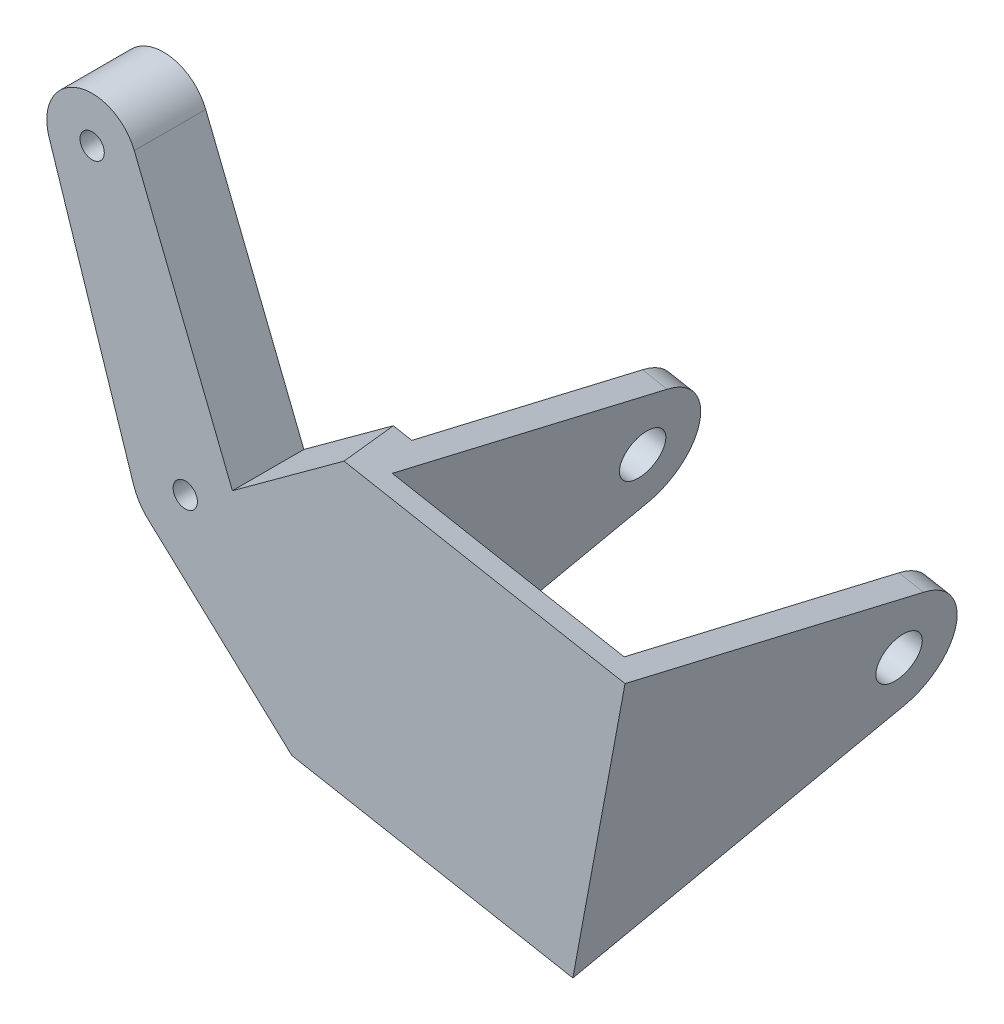
ISO-10303-21;
HEADER;
FILE_DESCRIPTION(('STEP AP214'),'2;1');
FILE_NAME('part.step','',(''),(''),'','','');
FILE_SCHEMA(('AUTOMOTIVE_DESIGN { 1 0 10303 214 1 1 1 1 }'));
ENDSEC;
DATA;
#1=APPLICATION_CONTEXT('core data for automotive mechanical design processes');
#2=APPLICATION_PROTOCOL_DEFINITION('international standard','automotive_design',2000,#1);
#3=PRODUCT_CONTEXT('',#1,'mechanical');
#4=PRODUCT('Part','Part','',(#3));
#5=PRODUCT_RELATED_PRODUCT_CATEGORY('part','',(#4));
#6=PRODUCT_DEFINITION_FORMATION('','',#4);
#7=PRODUCT_DEFINITION_CONTEXT('part definition',#1,'design');
#8=PRODUCT_DEFINITION('design','',#6,#7);
#9=PRODUCT_DEFINITION_SHAPE('','',#8);
#10=(LENGTH_UNIT() NAMED_UNIT(*) SI_UNIT(.MILLI.,.METRE.));
#11=(NAMED_UNIT(*) PLANE_ANGLE_UNIT() SI_UNIT($,.RADIAN.));
#12=(NAMED_UNIT(*) SI_UNIT($,.STERADIAN.) SOLID_ANGLE_UNIT());
#13=UNCERTAINTY_MEASURE_WITH_UNIT(LENGTH_MEASURE(1.E-05),#10,'distance_accuracy_value','');
#14=(GEOMETRIC_REPRESENTATION_CONTEXT(3) GLOBAL_UNCERTAINTY_ASSIGNED_CONTEXT((#13)) GLOBAL_UNIT_ASSIGNED_CONTEXT((#10,
#11,#12)) REPRESENTATION_CONTEXT('',''));
#15=CARTESIAN_POINT('',(0.,0.,0.));
#16=DIRECTION('',(0.,0.,1.));
#17=DIRECTION('',(1.,0.,0.));
#18=AXIS2_PLACEMENT_3D('',#15,#16,#17);
#19=CARTESIAN_POINT('',(1.70002900645727E-13,1.21430643318376E-13,5.));
#20=DIRECTION('',(0.,0.,1.));
#21=DIRECTION('',(1.,0.,0.));
#22=AXIS2_PLACEMENT_3D('',#19,#20,#21);
#23=PLANE('',#22);
#24=DIRECTION('',(0.73484710655978,-0.678232799251643,0.));
#25=VECTOR('',#24,1.);
#26=CARTESIAN_POINT('',(14.913314597375,-24.1267639064908,5.));
#27=LINE('',#26,#25);
#28=CARTESIAN_POINT('',(-4.95743734322314,-5.7869002918675,5.));
#29=VERTEX_POINT('',#28);
#30=CARTESIAN_POINT('',(14.913314597375,-24.1267639064908,5.));
#31=VERTEX_POINT('',#30);
#32=EDGE_CURVE('E160',#29,#31,#27,.T.);
#33=ORIENTED_EDGE('',*,*,#32,.T.);
#34=DIRECTION('',(0.983202602770421,-0.18251751122966,0.));
#35=VECTOR('',#34,1.);
#36=CARTESIAN_POINT('',(14.913314597375,-24.1267639064908,4.99999999999999));
#37=LINE('',#36,#35);
#38=CARTESIAN_POINT('',(54.2414187081918,-31.4274643556772,4.99999999999999));
#39=VERTEX_POINT('',#38);
#40=EDGE_CURVE('E164',#31,#39,#37,.T.);
#41=ORIENTED_EDGE('',*,*,#40,.T.);
#42=DIRECTION('',(0.18251751122966,0.983202602770421,0.));
#43=VECTOR('',#42,1.);
#44=CARTESIAN_POINT('',(57.891768932785,-11.7634123002687,4.99999999999999));
#45=LINE('',#44,#43);
#46=CARTESIAN_POINT('',(61.5421191573782,7.90063975513968,4.99999999999999));
#47=VERTEX_POINT('',#46);
#48=EDGE_CURVE('E412',#39,#47,#45,.T.);
#49=ORIENTED_EDGE('',*,*,#48,.T.);
#50=DIRECTION('',(0.983202602770421,-0.18251751122966,0.));
#51=VECTOR('',#50,1.);
#52=CARTESIAN_POINT('',(22.2140150465614,15.2013402043261,5.));
#53=LINE('',#52,#51);
#54=CARTESIAN_POINT('',(22.2140150465614,15.2013402043261,5.));
#55=VERTEX_POINT('',#54);
#56=EDGE_CURVE('E186',#55,#47,#53,.T.);
#57=ORIENTED_EDGE('',*,*,#56,.F.);
#58=DIRECTION('',(-0.807872671874875,-0.589357061583002,0.));
#59=VECTOR('',#58,1.);
#60=CARTESIAN_POINT('',(6.59911357683742,3.81000000000001,5.));
#61=LINE('',#60,#59);
#62=CARTESIAN_POINT('',(6.59911357683742,3.81000000000001,5.));
#63=VERTEX_POINT('',#62);
#64=EDGE_CURVE('E169',#55,#63,#61,.T.);
#65=ORIENTED_EDGE('',*,*,#64,.T.);
#66=DIRECTION('',(-0.371250998971319,0.92853254965176,0.));
#67=VECTOR('',#66,1.);
#68=CARTESIAN_POINT('',(-7.13478577041946,38.1597326954109,5.));
#69=LINE('',#68,#67);
#70=CARTESIAN_POINT('',(-7.13478577041946,38.1597326954109,5.));
#71=VERTEX_POINT('',#70);
#72=EDGE_CURVE('E246',#63,#71,#69,.T.);
#73=ORIENTED_EDGE('',*,*,#72,.T.);
#74=CARTESIAN_POINT('',(-13.0309674607081,35.8022888519431,5.));
#75=DIRECTION('',(0.,0.,1.));
#76=DIRECTION('',(-1.,0.,0.));
#77=AXIS2_PLACEMENT_3D('',#74,#75,#76);
#78=CIRCLE('',#77,6.35);
#79=CARTESIAN_POINT('',(-19.067093918271,33.8305694529642,5.));
#80=VERTEX_POINT('',#79);
#81=EDGE_CURVE('E249',#71,#80,#78,.T.);
#82=ORIENTED_EDGE('',*,*,#81,.T.);
#83=DIRECTION('',(0.310506991965177,-0.950571095679191,0.));
#84=VECTOR('',#83,1.);
#85=CARTESIAN_POINT('',(-7.24335174907544,-2.36606327877465,5.));
#86=LINE('',#85,#84);
#87=CARTESIAN_POINT('',(-7.24335174907544,-2.36606327877465,5.));
#88=VERTEX_POINT('',#87);
#89=EDGE_CURVE('E253',#80,#88,#86,.T.);
#90=ORIENTED_EDGE('',*,*,#89,.T.);
#91=CARTESIAN_POINT('',(1.70002900645727E-13,1.21430643318376E-13,5.));
#92=DIRECTION('',(0.,0.,1.));
#93=DIRECTION('',(1.,0.,0.));
#94=AXIS2_PLACEMENT_3D('',#91,#92,#93);
#95=CIRCLE('',#94,7.62000000000017);
#96=EDGE_CURVE('E166',#88,#29,#95,.T.);
#97=ORIENTED_EDGE('',*,*,#96,.T.);
#98=EDGE_LOOP('',(#33,#41,#49,#57,#65,#73,#82,#90,#97));
#99=FACE_BOUND('',#98,.T.);
#100=CARTESIAN_POINT('',(0.,0.,5.));
#101=DIRECTION('',(0.,0.,1.));
#102=DIRECTION('',(1.,0.,0.));
#103=AXIS2_PLACEMENT_3D('',#100,#101,#102);
#104=CIRCLE('',#103,1.7);
#105=CARTESIAN_POINT('',(1.7,0.,5.));
#106=VERTEX_POINT('',#105);
#107=EDGE_CURVE('E238',#106,#106,#104,.T.);
#108=ORIENTED_EDGE('',*,*,#107,.F.);
#109=EDGE_LOOP('',(#108));
#110=FACE_BOUND('',#109,.T.);
#111=CARTESIAN_POINT('',(-13.0309674607081,35.8022888519431,5.));
#112=DIRECTION('',(0.,0.,1.));
#113=DIRECTION('',(1.,0.,0.));
#114=AXIS2_PLACEMENT_3D('',#111,#112,#113);
#115=CIRCLE('',#114,1.7);
#116=CARTESIAN_POINT('',(-11.3309674607081,35.8022888519431,5.));
#117=VERTEX_POINT('',#116);
#118=EDGE_CURVE('E230',#117,#117,#115,.T.);
#119=ORIENTED_EDGE('',*,*,#118,.F.);
#120=EDGE_LOOP('',(#119));
#121=FACE_BOUND('',#120,.T.);
#122=ADVANCED_FACE('F50',(#99,#110,#121),#23,.T.);
#123=CARTESIAN_POINT('',(1.70002900645727E-13,1.21430643318376E-13,-5.));
#124=DIRECTION('',(0.,0.,1.));
#125=DIRECTION('',(1.,0.,0.));
#126=AXIS2_PLACEMENT_3D('',#123,#124,#125);
#127=PLANE('',#126);
#128=DIRECTION('',(0.18251751122966,0.983202602770421,0.));
#129=VECTOR('',#128,1.);
#130=CARTESIAN_POINT('',(19.7217384307204,1.77570866349598,-5.));
#131=LINE('',#130,#129);
#132=CARTESIAN_POINT('',(15.4215656830439,-21.3888688578242,-4.99999999999998));
#133=VERTEX_POINT('',#132);
#134=CARTESIAN_POINT('',(21.705716857147,12.4631914127458,-4.99999999999998));
#135=VERTEX_POINT('',#134);
#136=EDGE_CURVE('E242',#133,#135,#131,.T.);
#137=ORIENTED_EDGE('',*,*,#136,.F.);
#138=DIRECTION('',(-0.983202602770421,0.18251751122966,0.));
#139=VECTOR('',#138,1.);
#140=CARTESIAN_POINT('',(-3.32453561325327,-17.9089230722676,-5.));
#141=LINE('',#140,#139);
#142=CARTESIAN_POINT('',(11.0720558138381,-20.5814445139917,-5.));
#143=VERTEX_POINT('',#142);
#144=EDGE_CURVE('E176',#133,#143,#141,.T.);
#145=ORIENTED_EDGE('',*,*,#144,.T.);
#146=DIRECTION('',(-0.73484710655978,0.678232799251643,0.));
#147=VECTOR('',#146,1.);
#148=CARTESIAN_POINT('',(14.913314597375,-24.1267639064908,-5.));
#149=LINE('',#148,#147);
#150=CARTESIAN_POINT('',(-4.95743734322347,-5.78690029186723,-5.));
#151=VERTEX_POINT('',#150);
#152=EDGE_CURVE('E74',#143,#151,#149,.T.);
#153=ORIENTED_EDGE('',*,*,#152,.T.);
#154=CARTESIAN_POINT('',(1.70002900645727E-13,1.21430643318376E-13,-5.));
#155=DIRECTION('',(0.,0.,1.));
#156=DIRECTION('',(1.,0.,0.));
#157=AXIS2_PLACEMENT_3D('',#154,#155,#156);
#158=CIRCLE('',#157,7.62000000000017);
#159=CARTESIAN_POINT('',(-7.24335174907544,-2.36606327877465,-5.));
#160=VERTEX_POINT('',#159);
#161=EDGE_CURVE('E250',#160,#151,#158,.T.);
#162=ORIENTED_EDGE('',*,*,#161,.F.);
#163=DIRECTION('',(0.310506991965177,-0.950571095679191,0.));
#164=VECTOR('',#163,1.);
#165=CARTESIAN_POINT('',(-7.24335174907544,-2.36606327877465,-5.));
#166=LINE('',#165,#164);
#167=CARTESIAN_POINT('',(-19.067093918271,33.8305694529642,-5.));
#168=VERTEX_POINT('',#167);
#169=EDGE_CURVE('E268',#168,#160,#166,.T.);
#170=ORIENTED_EDGE('',*,*,#169,.F.);
#171=CARTESIAN_POINT('',(-13.0309674607081,35.8022888519431,-5.));
#172=DIRECTION('',(0.,0.,1.));
#173=DIRECTION('',(-1.,0.,0.));
#174=AXIS2_PLACEMENT_3D('',#171,#172,#173);
#175=CIRCLE('',#174,6.35);
#176=CARTESIAN_POINT('',(-7.13478577041946,38.1597326954109,-5.));
#177=VERTEX_POINT('',#176);
#178=EDGE_CURVE('E265',#177,#168,#175,.T.);
#179=ORIENTED_EDGE('',*,*,#178,.F.);
#180=DIRECTION('',(-0.371250998971319,0.92853254965176,0.));
#181=VECTOR('',#180,1.);
#182=CARTESIAN_POINT('',(-7.13478577041946,38.1597326954109,-5.));
#183=LINE('',#182,#181);
#184=CARTESIAN_POINT('',(6.59911357683742,3.81000000000001,-5.));
#185=VERTEX_POINT('',#184);
#186=EDGE_CURVE('E262',#185,#177,#183,.T.);
#187=ORIENTED_EDGE('',*,*,#186,.F.);
#188=DIRECTION('',(0.807872671874875,0.589357061583002,0.));
#189=VECTOR('',#188,1.);
#190=CARTESIAN_POINT('',(6.59911357683742,3.81000000000001,-5.));
#191=LINE('',#190,#189);
#192=CARTESIAN_POINT('',(19.1188963381761,12.9433976711406,-5.));
#193=VERTEX_POINT('',#192);
#194=EDGE_CURVE('E221',#185,#193,#191,.T.);
#195=ORIENTED_EDGE('',*,*,#194,.T.);
#196=DIRECTION('',(0.983202602770421,-0.18251751122966,0.));
#197=VECTOR('',#196,1.);
#198=CARTESIAN_POINT('',(2.95961556084977,15.9431371983025,-5.));
#199=LINE('',#198,#197);
#200=EDGE_CURVE('E177',#193,#135,#199,.T.);
#201=ORIENTED_EDGE('',*,*,#200,.T.);
#202=EDGE_LOOP('',(#137,#145,#153,#162,#170,#179,#187,#195,#201));
#203=FACE_BOUND('',#202,.T.);
#204=CARTESIAN_POINT('',(0.,0.,-5.));
#205=DIRECTION('',(0.,0.,1.));
#206=DIRECTION('',(1.,0.,0.));
#207=AXIS2_PLACEMENT_3D('',#204,#205,#206);
#208=CIRCLE('',#207,1.7);
#209=CARTESIAN_POINT('',(1.7,0.,-5.));
#210=VERTEX_POINT('',#209);
#211=EDGE_CURVE('E234',#210,#210,#208,.T.);
#212=ORIENTED_EDGE('',*,*,#211,.T.);
#213=EDGE_LOOP('',(#212));
#214=FACE_BOUND('',#213,.T.);
#215=CARTESIAN_POINT('',(-13.0309674607081,35.8022888519431,-5.));
#216=DIRECTION('',(0.,0.,1.));
#217=DIRECTION('',(1.,0.,0.));
#218=AXIS2_PLACEMENT_3D('',#215,#216,#217);
#219=CIRCLE('',#218,1.7);
#220=CARTESIAN_POINT('',(-11.3309674607081,35.8022888519431,-5.));
#221=VERTEX_POINT('',#220);
#222=EDGE_CURVE('E224',#221,#221,#219,.T.);
#223=ORIENTED_EDGE('',*,*,#222,.T.);
#224=EDGE_LOOP('',(#223));
#225=FACE_BOUND('',#224,.T.);
#226=ADVANCED_FACE('F292',(#203,#214,#225),#127,.F.);
#227=CARTESIAN_POINT('',(-7.13478577041946,38.1597326954109,5.));
#228=DIRECTION('',(-0.92853254965176,-0.371250998971319,0.));
#229=DIRECTION('',(0.371250998971319,-0.92853254965176,0.));
#230=AXIS2_PLACEMENT_3D('',#227,#228,#229);
#231=PLANE('',#230);
#232=ORIENTED_EDGE('',*,*,#186,.T.);
#233=DIRECTION('',(0.,0.,-1.));
#234=VECTOR('',#233,1.);
#235=CARTESIAN_POINT('',(-7.13478577041946,38.1597326954109,5.));
#236=LINE('',#235,#234);
#237=EDGE_CURVE('E59',#71,#177,#236,.T.);
#238=ORIENTED_EDGE('',*,*,#237,.F.);
#239=ORIENTED_EDGE('',*,*,#72,.F.);
#240=DIRECTION('',(0.,0.,-1.));
#241=VECTOR('',#240,1.);
#242=CARTESIAN_POINT('',(6.59911357683742,3.81000000000001,5.));
#243=LINE('',#242,#241);
#244=EDGE_CURVE('E12',#63,#185,#243,.T.);
#245=ORIENTED_EDGE('',*,*,#244,.T.);
#246=EDGE_LOOP('',(#232,#238,#239,#245));
#247=FACE_BOUND('',#246,.T.);
#248=ADVANCED_FACE('F52',(#247),#231,.F.);
#249=CARTESIAN_POINT('',(-13.0309674607081,35.8022888519431,5.));
#250=DIRECTION('',(0.,0.,-1.));
#251=DIRECTION('',(-1.,0.,0.));
#252=AXIS2_PLACEMENT_3D('',#249,#250,#251);
#253=CYLINDRICAL_SURFACE('',#252,6.35);
#254=ORIENTED_EDGE('',*,*,#178,.T.);
#255=DIRECTION('',(0.,0.,-1.));
#256=VECTOR('',#255,1.);
#257=CARTESIAN_POINT('',(-19.067093918271,33.8305694529642,5.));
#258=LINE('',#257,#256);
#259=EDGE_CURVE('E276',#80,#168,#258,.T.);
#260=ORIENTED_EDGE('',*,*,#259,.F.);
#261=ORIENTED_EDGE('',*,*,#81,.F.);
#262=ORIENTED_EDGE('',*,*,#237,.T.);
#263=EDGE_LOOP('',(#254,#260,#261,#262));
#264=FACE_BOUND('',#263,.T.);
#265=ADVANCED_FACE('F285',(#264),#253,.T.);
#266=CARTESIAN_POINT('',(-7.24335174907544,-2.36606327877465,5.));
#267=DIRECTION('',(0.950571095679191,0.310506991965177,0.));
#268=DIRECTION('',(-0.310506991965177,0.950571095679191,0.));
#269=AXIS2_PLACEMENT_3D('',#266,#267,#268);
#270=PLANE('',#269);
#271=ORIENTED_EDGE('',*,*,#169,.T.);
#272=DIRECTION('',(0.,0.,-1.));
#273=VECTOR('',#272,1.);
#274=CARTESIAN_POINT('',(-7.24335174907544,-2.36606327877465,5.));
#275=LINE('',#274,#273);
#276=EDGE_CURVE('E258',#88,#160,#275,.T.);
#277=ORIENTED_EDGE('',*,*,#276,.F.);
#278=ORIENTED_EDGE('',*,*,#89,.F.);
#279=ORIENTED_EDGE('',*,*,#259,.T.);
#280=EDGE_LOOP('',(#271,#277,#278,#279));
#281=FACE_BOUND('',#280,.T.);
#282=ADVANCED_FACE('F296',(#281),#270,.F.);
#283=CARTESIAN_POINT('',(1.70002900645727E-13,1.21430643318376E-13,5.));
#284=DIRECTION('',(0.,0.,-1.));
#285=DIRECTION('',(-1.,0.,0.));
#286=AXIS2_PLACEMENT_3D('',#283,#284,#285);
#287=CYLINDRICAL_SURFACE('',#286,7.62000000000017);
#288=ORIENTED_EDGE('',*,*,#161,.T.);
#289=DIRECTION('',(0.,0.,1.));
#290=VECTOR('',#289,1.);
#291=CARTESIAN_POINT('',(-4.95743734322318,-5.78690029186749,-52.8015438863807));
#292=LINE('',#291,#290);
#293=EDGE_CURVE('E66',#151,#29,#292,.T.);
#294=ORIENTED_EDGE('',*,*,#293,.T.);
#295=ORIENTED_EDGE('',*,*,#96,.F.);
#296=ORIENTED_EDGE('',*,*,#276,.T.);
#297=EDGE_LOOP('',(#288,#294,#295,#296));
#298=FACE_BOUND('',#297,.T.);
#299=ADVANCED_FACE('F298',(#298),#287,.T.);
#300=CARTESIAN_POINT('',(0.,0.,5.));
#301=DIRECTION('',(0.,0.,-1.));
#302=DIRECTION('',(-1.,0.,0.));
#303=AXIS2_PLACEMENT_3D('',#300,#301,#302);
#304=CYLINDRICAL_SURFACE('',#303,1.7);
#305=ORIENTED_EDGE('',*,*,#107,.T.);
#306=EDGE_LOOP('',(#305));
#307=FACE_BOUND('',#306,.T.);
#308=ORIENTED_EDGE('',*,*,#211,.F.);
#309=EDGE_LOOP('',(#308));
#310=FACE_BOUND('',#309,.T.);
#311=ADVANCED_FACE('F300',(#307,#310),#304,.F.);
#312=CARTESIAN_POINT('',(-13.0309674607081,35.8022888519431,5.));
#313=DIRECTION('',(0.,0.,-1.));
#314=DIRECTION('',(-1.,0.,0.));
#315=AXIS2_PLACEMENT_3D('',#312,#313,#314);
#316=CYLINDRICAL_SURFACE('',#315,1.7);
#317=ORIENTED_EDGE('',*,*,#118,.T.);
#318=EDGE_LOOP('',(#317));
#319=FACE_BOUND('',#318,.T.);
#320=ORIENTED_EDGE('',*,*,#222,.F.);
#321=EDGE_LOOP('',(#320));
#322=FACE_BOUND('',#321,.T.);
#323=ADVANCED_FACE('F307',(#319,#322),#316,.F.);
#324=CARTESIAN_POINT('',(14.913314597375,-24.1267639064908,-52.8015438863807));
#325=DIRECTION('',(-0.678232799251643,-0.73484710655978,0.));
#326=DIRECTION('',(0.73484710655978,-0.678232799251643,0.));
#327=AXIS2_PLACEMENT_3D('',#324,#325,#326);
#328=PLANE('',#327);
#329=DIRECTION('',(-0.340421888495219,0.3141950050556,-0.886224822847713));
#330=VECTOR('',#329,1.);
#331=CARTESIAN_POINT('',(-2.52485212650756,-8.03207356154952,-40.3970109970726));
#332=LINE('',#331,#330);
#333=EDGE_CURVE('E172',#31,#143,#332,.T.);
#334=ORIENTED_EDGE('',*,*,#333,.F.);
#335=ORIENTED_EDGE('',*,*,#32,.F.);
#336=ORIENTED_EDGE('',*,*,#293,.F.);
#337=ORIENTED_EDGE('',*,*,#152,.F.);
#338=EDGE_LOOP('',(#334,#335,#336,#337));
#339=FACE_BOUND('',#338,.T.);
#340=ADVANCED_FACE('F173',(#339),#328,.T.);
#341=CARTESIAN_POINT('',(6.59911357683742,3.81000000000001,-52.8015438863807));
#342=DIRECTION('',(-0.589357061583002,0.807872671874875,0.));
#343=DIRECTION('',(-0.807872671874875,-0.589357061583002,0.));
#344=AXIS2_PLACEMENT_3D('',#341,#342,#343);
#345=PLANE('',#344);
#346=DIRECTION('',(0.289026147095447,0.210849564173909,0.933812801145301));
#347=VECTOR('',#346,1.);
#348=CARTESIAN_POINT('',(4.61498301991629,2.36254250386974,-51.8606043411711));
#349=LINE('',#348,#347);
#350=EDGE_CURVE('E432',#193,#55,#349,.T.);
#351=ORIENTED_EDGE('',*,*,#350,.F.);
#352=ORIENTED_EDGE('',*,*,#194,.F.);
#353=ORIENTED_EDGE('',*,*,#244,.F.);
#354=ORIENTED_EDGE('',*,*,#64,.F.);
#355=EDGE_LOOP('',(#351,#352,#353,#354));
#356=FACE_BOUND('',#355,.T.);
#357=ADVANCED_FACE('F325',(#356),#345,.T.);
#358=CARTESIAN_POINT('',(18.5636648219682,-4.46271185108232,-37.));
#359=DIRECTION('',(0.983202602770421,-0.18251751122966,0.));
#360=DIRECTION('',(0.18251751122966,0.983202602770421,0.));
#361=AXIS2_PLACEMENT_3D('',#358,#359,#360);
#362=CYLINDRICAL_SURFACE('',#361,8.);
#363=DIRECTION('',(0.983202602770421,-0.18251751122966,0.));
#364=VECTOR('',#363,1.);
#365=CARTESIAN_POINT('',(17.1570439999349,-12.0400300164278,-39.1460818446993));
#366=LINE('',#365,#364);
#367=CARTESIAN_POINT('',(53.0439390010553,-18.7019191763104,-39.1460818446993));
#368=VERTEX_POINT('',#367);
#369=CARTESIAN_POINT('',(56.4851481107518,-19.3407304656142,-39.1460818446993));
#370=VERTEX_POINT('',#369);
#371=EDGE_CURVE('E185',#368,#370,#366,.T.);
#372=ORIENTED_EDGE('',*,*,#371,.F.);
#373=CARTESIAN_POINT('',(54.4505598230886,-11.1246010109649,-37.));
#374=DIRECTION('',(0.983202602770421,-0.18251751122966,0.));
#375=DIRECTION('',(0.18251751122966,0.983202602770421,0.));
#376=AXIS2_PLACEMENT_3D('',#373,#374,#375);
#377=CIRCLE('',#376,8.);
#378=CARTESIAN_POINT('',(55.8634669462817,-3.51341920360187,-39.0183173577254));
#379=VERTEX_POINT('',#378);
#380=EDGE_CURVE('E385',#368,#379,#377,.T.);
#381=ORIENTED_EDGE('',*,*,#380,.T.);
#382=DIRECTION('',(0.983202602770421,-0.18251751122966,0.));
#383=VECTOR('',#382,1.);
#384=CARTESIAN_POINT('',(19.9765719451613,3.14846995628074,-39.0183173577254));
#385=LINE('',#384,#383);
#386=CARTESIAN_POINT('',(59.3046760559782,-4.15223049290567,-39.0183173577254));
#387=VERTEX_POINT('',#386);
#388=EDGE_CURVE('E199',#379,#387,#385,.T.);
#389=ORIENTED_EDGE('',*,*,#388,.T.);
#390=CARTESIAN_POINT('',(57.891768932785,-11.7634123002687,-37.));
#391=DIRECTION('',(-0.983202602770421,0.18251751122966,0.));
#392=DIRECTION('',(-0.18251751122966,-0.983202602770421,0.));
#393=AXIS2_PLACEMENT_3D('',#390,#391,#392);
#394=CIRCLE('',#393,8.);
#395=EDGE_CURVE('E421',#387,#370,#394,.T.);
#396=ORIENTED_EDGE('',*,*,#395,.T.);
#397=EDGE_LOOP('',(#372,#381,#389,#396));
#398=FACE_BOUND('',#397,.T.);
#399=ADVANCED_FACE('F328',(#398),#362,.T.);
#400=CARTESIAN_POINT('',(19.9700832843011,3.11351622387832,-39.1459719706153));
#401=DIRECTION('',(-0.175826430038973,-0.947158453375055,0.268283303058398));
#402=DIRECTION('',(0.0489664007786915,0.263776841846862,0.96334005901347));
#403=AXIS2_PLACEMENT_3D('',#400,#401,#402);
#404=PLANE('',#403);
#405=DIRECTION('',(-0.983202602770421,0.18251751122966,0.));
#406=VECTOR('',#405,1.);
#407=CARTESIAN_POINT('',(22.0361106802663,14.242988127273,1.49999999999999));
#408=LINE('',#407,#406);
#409=CARTESIAN_POINT('',(57.9230056813867,7.58109896739039,1.49999999999999));
#410=VERTEX_POINT('',#409);
#411=CARTESIAN_POINT('',(25.4773197899628,13.6041768379692,1.49999999999999));
#412=VERTEX_POINT('',#411);
#413=EDGE_CURVE('E396',#410,#412,#408,.T.);
#414=ORIENTED_EDGE('',*,*,#413,.T.);
#415=DIRECTION('',(-0.0489664007786915,-0.263776841846862,-0.96334005901347));
#416=VECTOR('',#415,1.);
#417=CARTESIAN_POINT('',(23.4112923939976,2.47470493457452,-39.1459719706153));
#418=LINE('',#417,#416);
#419=CARTESIAN_POINT('',(23.4177810548578,2.50965866697693,-39.0183173577254));
#420=VERTEX_POINT('',#419);
#421=EDGE_CURVE('E403',#412,#420,#418,.T.);
#422=ORIENTED_EDGE('',*,*,#421,.T.);
#423=CARTESIAN_POINT('',(19.9765719451613,3.14846995628074,-39.0183173577254));
#424=VERTEX_POINT('',#423);
#425=EDGE_CURVE('E200',#424,#420,#385,.T.);
#426=ORIENTED_EDGE('',*,*,#425,.F.);
#427=DIRECTION('',(-0.0489664007786915,-0.263776841846862,-0.96334005901347));
#428=VECTOR('',#427,1.);
#429=CARTESIAN_POINT('',(19.9700832843011,3.11351622387832,-39.1459719706153));
#430=LINE('',#429,#428);
#431=EDGE_CURVE('E408',#135,#424,#430,.T.);
#432=ORIENTED_EDGE('',*,*,#431,.F.);
#433=ORIENTED_EDGE('',*,*,#200,.F.);
#434=ORIENTED_EDGE('',*,*,#350,.T.);
#435=ORIENTED_EDGE('',*,*,#56,.T.);
#436=DIRECTION('',(-0.0489664007786915,-0.263776841846862,-0.96334005901347));
#437=VECTOR('',#436,1.);
#438=CARTESIAN_POINT('',(59.2981873951179,-4.1871842253081,-39.1459719706153));
#439=LINE('',#438,#437);
#440=EDGE_CURVE('E407',#47,#387,#439,.T.);
#441=ORIENTED_EDGE('',*,*,#440,.T.);
#442=ORIENTED_EDGE('',*,*,#388,.F.);
#443=DIRECTION('',(0.0489664007786915,0.263776841846862,0.96334005901347));
#444=VECTOR('',#443,1.);
#445=CARTESIAN_POINT('',(55.8569782854215,-3.54837293600428,-39.1459719706153));
#446=LINE('',#445,#444);
#447=EDGE_CURVE('E392',#379,#410,#446,.T.);
#448=ORIENTED_EDGE('',*,*,#447,.T.);
#449=EDGE_LOOP('',(#414,#422,#426,#432,#433,#434,#435,#441,#442,#448));
#450=FACE_BOUND('',#449,.T.);
#451=ADVANCED_FACE('F330',(#450),#404,.F.);
#452=CARTESIAN_POINT('',(22.0048739316647,-5.10152314038613,-37.));
#453=DIRECTION('',(-0.983202602770421,0.18251751122966,0.));
#454=DIRECTION('',(-0.18251751122966,-0.983202602770421,0.));
#455=AXIS2_PLACEMENT_3D('',#452,#453,#454);
#456=CIRCLE('',#455,8.);
#457=CARTESIAN_POINT('',(20.5982531096314,-12.6788413057316,-39.1460818446993));
#458=VERTEX_POINT('',#457);
#459=EDGE_CURVE('E400',#420,#458,#456,.T.);
#460=ORIENTED_EDGE('',*,*,#459,.T.);
#461=CARTESIAN_POINT('',(17.1570439999349,-12.0400300164278,-39.1460818446993));
#462=VERTEX_POINT('',#461);
#463=EDGE_CURVE('E190',#462,#458,#366,.T.);
#464=ORIENTED_EDGE('',*,*,#463,.F.);
#465=CARTESIAN_POINT('',(18.5636648219682,-4.46271185108232,-37.));
#466=DIRECTION('',(-0.983202602770421,0.18251751122966,0.));
#467=DIRECTION('',(-0.18251751122966,-0.983202602770421,0.));
#468=AXIS2_PLACEMENT_3D('',#465,#466,#467);
#469=CIRCLE('',#468,8.);
#470=EDGE_CURVE('E411',#424,#462,#469,.T.);
#471=ORIENTED_EDGE('',*,*,#470,.F.);
#472=ORIENTED_EDGE('',*,*,#425,.T.);
#473=EDGE_LOOP('',(#460,#464,#471,#472));
#474=FACE_BOUND('',#473,.T.);
#475=ADVANCED_FACE('F333',(#474),#362,.T.);
#476=CARTESIAN_POINT('',(17.1570439999349,-12.0400300164278,-39.1460818446993));
#477=DIRECTION('',(-0.175827602754155,-0.947164770668184,-0.268260230587416));
#478=DIRECTION('',(-0.04896218964871,-0.263754156933341,0.963346484233573));
#479=AXIS2_PLACEMENT_3D('',#476,#477,#478);
#480=PLANE('',#479);
#481=DIRECTION('',(0.04896218964871,0.263754156933341,-0.963346484233573));
#482=VECTOR('',#481,1.);
#483=CARTESIAN_POINT('',(20.5982531096314,-12.6788413057316,-39.1460818446993));
#484=LINE('',#483,#482);
#485=CARTESIAN_POINT('',(18.5324115870556,-23.8073119287613,1.49999999999999));
#486=VERTEX_POINT('',#485);
#487=EDGE_CURVE('E170',#486,#458,#484,.T.);
#488=ORIENTED_EDGE('',*,*,#487,.F.);
#489=DIRECTION('',(-0.983202602770421,0.18251751122966,0.));
#490=VECTOR('',#489,1.);
#491=CARTESIAN_POINT('',(15.0912024773591,-23.1685006394575,1.49999999999999));
#492=LINE('',#491,#490);
#493=CARTESIAN_POINT('',(50.9780974784795,-29.8303897993401,1.49999999999999));
#494=VERTEX_POINT('',#493);
#495=EDGE_CURVE('E207',#494,#486,#492,.T.);
#496=ORIENTED_EDGE('',*,*,#495,.F.);
#497=DIRECTION('',(-0.04896218964871,-0.263754156933341,0.963346484233573));
#498=VECTOR('',#497,1.);
#499=CARTESIAN_POINT('',(53.0439390010553,-18.7019191763104,-39.1460818446993));
#500=LINE('',#499,#498);
#501=EDGE_CURVE('E204',#368,#494,#500,.T.);
#502=ORIENTED_EDGE('',*,*,#501,.F.);
#503=ORIENTED_EDGE('',*,*,#371,.T.);
#504=DIRECTION('',(0.04896218964871,0.263754156933341,-0.963346484233573));
#505=VECTOR('',#504,1.);
#506=CARTESIAN_POINT('',(56.4851481107518,-19.3407304656142,-39.1460818446993));
#507=LINE('',#506,#505);
#508=EDGE_CURVE('E183',#39,#370,#507,.T.);
#509=ORIENTED_EDGE('',*,*,#508,.F.);
#510=ORIENTED_EDGE('',*,*,#40,.F.);
#511=ORIENTED_EDGE('',*,*,#333,.T.);
#512=ORIENTED_EDGE('',*,*,#144,.F.);
#513=DIRECTION('',(0.04896218964871,0.263754156933341,-0.963346484233573));
#514=VECTOR('',#513,1.);
#515=CARTESIAN_POINT('',(17.1570439999349,-12.0400300164278,-39.1460818446993));
#516=LINE('',#515,#514);
#517=EDGE_CURVE('E193',#133,#462,#516,.T.);
#518=ORIENTED_EDGE('',*,*,#517,.T.);
#519=ORIENTED_EDGE('',*,*,#463,.T.);
#520=EDGE_LOOP('',(#488,#496,#502,#503,#509,#510,#511,#512,#518,#519));
#521=FACE_BOUND('',#520,.T.);
#522=ADVANCED_FACE('F181',(#521),#480,.T.);
#523=CARTESIAN_POINT('',(18.5636648219682,-4.46271185108232,-37.));
#524=DIRECTION('',(-0.983202602770421,0.18251751122966,0.));
#525=DIRECTION('',(-0.18251751122966,-0.983202602770421,0.));
#526=AXIS2_PLACEMENT_3D('',#523,#524,#525);
#527=PLANE('',#526);
#528=CARTESIAN_POINT('',(18.5636648219682,-4.46271185108232,-37.));
#529=DIRECTION('',(-0.983202602770421,0.18251751122966,0.));
#530=DIRECTION('',(-0.18251751122966,-0.983202602770421,0.));
#531=AXIS2_PLACEMENT_3D('',#528,#529,#530);
#532=CIRCLE('',#531,3.2);
#533=CARTESIAN_POINT('',(17.9796087860333,-7.60896017994767,-37.));
#534=VERTEX_POINT('',#533);
#535=EDGE_CURVE('E370',#534,#534,#532,.T.);
#536=ORIENTED_EDGE('',*,*,#535,.F.);
#537=EDGE_LOOP('',(#536));
#538=FACE_BOUND('',#537,.T.);
#539=ORIENTED_EDGE('',*,*,#517,.F.);
#540=ORIENTED_EDGE('',*,*,#136,.T.);
#541=ORIENTED_EDGE('',*,*,#431,.T.);
#542=ORIENTED_EDGE('',*,*,#470,.T.);
#543=EDGE_LOOP('',(#539,#540,#541,#542));
#544=FACE_BOUND('',#543,.T.);
#545=ADVANCED_FACE('F340',(#538,#544),#527,.T.);
#546=CARTESIAN_POINT('',(57.891768932785,-11.7634123002687,-37.));
#547=DIRECTION('',(-0.983202602770421,0.18251751122966,0.));
#548=DIRECTION('',(-0.18251751122966,-0.983202602770421,0.));
#549=AXIS2_PLACEMENT_3D('',#546,#547,#548);
#550=PLANE('',#549);
#551=CARTESIAN_POINT('',(57.891768932785,-11.7634123002687,-37.));
#552=DIRECTION('',(-0.983202602770421,0.18251751122966,0.));
#553=DIRECTION('',(-0.18251751122966,-0.983202602770421,0.));
#554=AXIS2_PLACEMENT_3D('',#551,#552,#553);
#555=CIRCLE('',#554,3.2);
#556=CARTESIAN_POINT('',(57.3077128968501,-14.9096606291341,-37.));
#557=VERTEX_POINT('',#556);
#558=EDGE_CURVE('E218',#557,#557,#555,.T.);
#559=ORIENTED_EDGE('',*,*,#558,.T.);
#560=EDGE_LOOP('',(#559));
#561=FACE_BOUND('',#560,.T.);
#562=ORIENTED_EDGE('',*,*,#440,.F.);
#563=ORIENTED_EDGE('',*,*,#48,.F.);
#564=ORIENTED_EDGE('',*,*,#508,.T.);
#565=ORIENTED_EDGE('',*,*,#395,.F.);
#566=EDGE_LOOP('',(#562,#563,#564,#565));
#567=FACE_BOUND('',#566,.T.);
#568=ADVANCED_FACE('F341',(#561,#567),#550,.F.);
#569=CARTESIAN_POINT('',(25.6552241562579,14.5625289150223,-45.));
#570=DIRECTION('',(-0.983202602770421,0.18251751122966,0.));
#571=DIRECTION('',(-0.18251751122966,-0.983202602770421,0.));
#572=AXIS2_PLACEMENT_3D('',#569,#570,#571);
#573=PLANE('',#572);
#574=CARTESIAN_POINT('',(22.0048739316647,-5.10152314038613,-37.));
#575=DIRECTION('',(-0.983202602770421,0.18251751122966,0.));
#576=DIRECTION('',(-0.18251751122966,-0.983202602770421,0.));
#577=AXIS2_PLACEMENT_3D('',#574,#575,#576);
#578=CIRCLE('',#577,3.2);
#579=CARTESIAN_POINT('',(21.4208178957297,-8.24777146925148,-37.));
#580=VERTEX_POINT('',#579);
#581=EDGE_CURVE('E217',#580,#580,#578,.T.);
#582=ORIENTED_EDGE('',*,*,#581,.T.);
#583=EDGE_LOOP('',(#582));
#584=FACE_BOUND('',#583,.T.);
#585=DIRECTION('',(-0.18251751122966,-0.983202602770421,0.));
#586=VECTOR('',#585,1.);
#587=CARTESIAN_POINT('',(25.6552241562579,14.5625289150223,1.49999999999999));
#588=LINE('',#587,#586);
#589=EDGE_CURVE('E381',#412,#486,#588,.T.);
#590=ORIENTED_EDGE('',*,*,#589,.T.);
#591=ORIENTED_EDGE('',*,*,#487,.T.);
#592=ORIENTED_EDGE('',*,*,#459,.F.);
#593=ORIENTED_EDGE('',*,*,#421,.F.);
#594=EDGE_LOOP('',(#590,#591,#592,#593));
#595=FACE_BOUND('',#594,.T.);
#596=ADVANCED_FACE('F344',(#584,#595),#573,.F.);
#597=CARTESIAN_POINT('',(25.6552241562579,14.5625289150223,1.49999999999999));
#598=DIRECTION('',(0.,0.,1.));
#599=DIRECTION('',(-0.983202602770421,0.18251751122966,0.));
#600=AXIS2_PLACEMENT_3D('',#597,#598,#599);
#601=PLANE('',#600);
#602=DIRECTION('',(-0.18251751122966,-0.983202602770421,0.));
#603=VECTOR('',#602,1.);
#604=CARTESIAN_POINT('',(58.1009100476818,8.53945104444349,1.49999999999999));
#605=LINE('',#604,#603);
#606=EDGE_CURVE('E376',#410,#494,#605,.T.);
#607=ORIENTED_EDGE('',*,*,#606,.T.);
#608=ORIENTED_EDGE('',*,*,#495,.T.);
#609=ORIENTED_EDGE('',*,*,#589,.F.);
#610=ORIENTED_EDGE('',*,*,#413,.F.);
#611=EDGE_LOOP('',(#607,#608,#609,#610));
#612=FACE_BOUND('',#611,.T.);
#613=ADVANCED_FACE('F351',(#612),#601,.F.);
#614=CARTESIAN_POINT('',(58.1009100476818,8.5394510444435,-45.));
#615=DIRECTION('',(0.983202602770421,-0.18251751122966,0.));
#616=DIRECTION('',(0.18251751122966,0.983202602770421,0.));
#617=AXIS2_PLACEMENT_3D('',#614,#615,#616);
#618=PLANE('',#617);
#619=CARTESIAN_POINT('',(54.4505598230886,-11.1246010109649,-37.));
#620=DIRECTION('',(0.983202602770421,-0.18251751122966,0.));
#621=DIRECTION('',(0.18251751122966,0.983202602770421,0.));
#622=AXIS2_PLACEMENT_3D('',#619,#620,#621);
#623=CIRCLE('',#622,3.2);
#624=CARTESIAN_POINT('',(55.0346158590235,-7.97835268209958,-37.));
#625=VERTEX_POINT('',#624);
#626=EDGE_CURVE('E213',#625,#625,#623,.T.);
#627=ORIENTED_EDGE('',*,*,#626,.T.);
#628=EDGE_LOOP('',(#627));
#629=FACE_BOUND('',#628,.T.);
#630=ORIENTED_EDGE('',*,*,#380,.F.);
#631=ORIENTED_EDGE('',*,*,#501,.T.);
#632=ORIENTED_EDGE('',*,*,#606,.F.);
#633=ORIENTED_EDGE('',*,*,#447,.F.);
#634=EDGE_LOOP('',(#630,#631,#632,#633));
#635=FACE_BOUND('',#634,.T.);
#636=ADVANCED_FACE('F353',(#629,#635),#618,.F.);
#637=CARTESIAN_POINT('',(57.891768932785,-11.7634123002687,-37.));
#638=DIRECTION('',(-0.983202602770421,0.18251751122966,0.));
#639=DIRECTION('',(-0.18251751122966,-0.983202602770421,0.));
#640=AXIS2_PLACEMENT_3D('',#637,#638,#639);
#641=CYLINDRICAL_SURFACE('',#640,3.2);
#642=ORIENTED_EDGE('',*,*,#558,.F.);
#643=EDGE_LOOP('',(#642));
#644=FACE_BOUND('',#643,.T.);
#645=ORIENTED_EDGE('',*,*,#626,.F.);
#646=EDGE_LOOP('',(#645));
#647=FACE_BOUND('',#646,.T.);
#648=ADVANCED_FACE('F356',(#644,#647),#641,.F.);
#649=ORIENTED_EDGE('',*,*,#535,.T.);
#650=EDGE_LOOP('',(#649));
#651=FACE_BOUND('',#650,.T.);
#652=ORIENTED_EDGE('',*,*,#581,.F.);
#653=EDGE_LOOP('',(#652));
#654=FACE_BOUND('',#653,.T.);
#655=ADVANCED_FACE('F361',(#651,#654),#641,.F.);
#656=CLOSED_SHELL('',(#122,#226,#248,#265,#282,#299,#311,#323,#340,#357,#399,#451,#475,#522,
#545,#568,#596,#613,#636,#648,#655));
#657=MANIFOLD_SOLID_BREP('B2',#656);
#658=ADVANCED_BREP_SHAPE_REPRESENTATION('',(#18,#657),#14);
#659=SHAPE_DEFINITION_REPRESENTATION(#9,#658);
ENDSEC;
END-ISO-10303-21;
